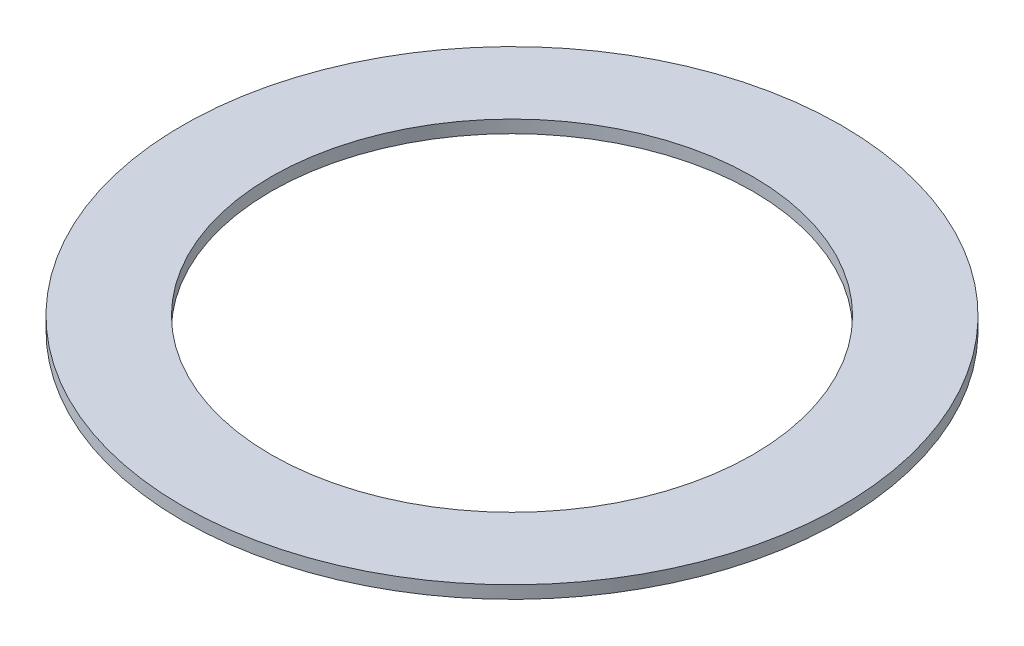
ISO-10303-21;
HEADER;
FILE_DESCRIPTION(('STEP AP214'),'2;1');
FILE_NAME('part.step','',(''),(''),'','','');
FILE_SCHEMA(('AUTOMOTIVE_DESIGN { 1 0 10303 214 1 1 1 1 }'));
ENDSEC;
DATA;
#1=APPLICATION_CONTEXT('core data for automotive mechanical design processes');
#2=APPLICATION_PROTOCOL_DEFINITION('international standard','automotive_design',2000,#1);
#3=PRODUCT_CONTEXT('',#1,'mechanical');
#4=PRODUCT('Part','Part','',(#3));
#5=PRODUCT_RELATED_PRODUCT_CATEGORY('part','',(#4));
#6=PRODUCT_DEFINITION_FORMATION('','',#4);
#7=PRODUCT_DEFINITION_CONTEXT('part definition',#1,'design');
#8=PRODUCT_DEFINITION('design','',#6,#7);
#9=PRODUCT_DEFINITION_SHAPE('','',#8);
#10=(LENGTH_UNIT() NAMED_UNIT(*) SI_UNIT(.MILLI.,.METRE.));
#11=(NAMED_UNIT(*) PLANE_ANGLE_UNIT() SI_UNIT($,.RADIAN.));
#12=(NAMED_UNIT(*) SI_UNIT($,.STERADIAN.) SOLID_ANGLE_UNIT());
#13=UNCERTAINTY_MEASURE_WITH_UNIT(LENGTH_MEASURE(1.E-05),#10,'distance_accuracy_value','');
#14=(GEOMETRIC_REPRESENTATION_CONTEXT(3) GLOBAL_UNCERTAINTY_ASSIGNED_CONTEXT((#13)) GLOBAL_UNIT_ASSIGNED_CONTEXT((#10,
#11,#12)) REPRESENTATION_CONTEXT('',''));
#15=CARTESIAN_POINT('',(0.,0.,0.));
#16=DIRECTION('',(0.,0.,1.));
#17=DIRECTION('',(1.,0.,0.));
#18=AXIS2_PLACEMENT_3D('',#15,#16,#17);
#19=CARTESIAN_POINT('',(0.,0.5,0.));
#20=DIRECTION('',(0.,1.,0.));
#21=DIRECTION('',(0.,0.,1.));
#22=AXIS2_PLACEMENT_3D('',#19,#20,#21);
#23=PLANE('',#22);
#24=CARTESIAN_POINT('',(0.,0.5,0.));
#25=DIRECTION('',(0.,1.,0.));
#26=DIRECTION('',(0.,0.,1.));
#27=AXIS2_PLACEMENT_3D('',#24,#25,#26);
#28=CIRCLE('',#27,13.);
#29=CARTESIAN_POINT('',(0.,0.5,13.));
#30=VERTEX_POINT('',#29);
#31=EDGE_CURVE('E10',#30,#30,#28,.T.);
#32=ORIENTED_EDGE('',*,*,#31,.T.);
#33=EDGE_LOOP('',(#32));
#34=FACE_BOUND('',#33,.T.);
#35=CARTESIAN_POINT('',(0.,0.5,0.));
#36=DIRECTION('',(0.,1.,0.));
#37=DIRECTION('',(0.,0.,1.));
#38=AXIS2_PLACEMENT_3D('',#35,#36,#37);
#39=CIRCLE('',#38,9.5);
#40=CARTESIAN_POINT('',(0.,0.5,9.5));
#41=VERTEX_POINT('',#40);
#42=EDGE_CURVE('E46',#41,#41,#39,.T.);
#43=ORIENTED_EDGE('',*,*,#42,.F.);
#44=EDGE_LOOP('',(#43));
#45=FACE_BOUND('',#44,.T.);
#46=ADVANCED_FACE('F35',(#34,#45),#23,.T.);
#47=CARTESIAN_POINT('',(0.,0.,0.));
#48=DIRECTION('',(0.,1.,0.));
#49=DIRECTION('',(0.,0.,1.));
#50=AXIS2_PLACEMENT_3D('',#47,#48,#49);
#51=PLANE('',#50);
#52=CARTESIAN_POINT('',(0.,0.,0.));
#53=DIRECTION('',(0.,1.,0.));
#54=DIRECTION('',(0.,0.,1.));
#55=AXIS2_PLACEMENT_3D('',#52,#53,#54);
#56=CIRCLE('',#55,13.);
#57=CARTESIAN_POINT('',(0.,0.,13.));
#58=VERTEX_POINT('',#57);
#59=EDGE_CURVE('E39',#58,#58,#56,.T.);
#60=ORIENTED_EDGE('',*,*,#59,.F.);
#61=EDGE_LOOP('',(#60));
#62=FACE_BOUND('',#61,.T.);
#63=CARTESIAN_POINT('',(0.,0.,0.));
#64=DIRECTION('',(0.,1.,0.));
#65=DIRECTION('',(0.,0.,1.));
#66=AXIS2_PLACEMENT_3D('',#63,#64,#65);
#67=CIRCLE('',#66,9.5);
#68=CARTESIAN_POINT('',(0.,0.,9.5));
#69=VERTEX_POINT('',#68);
#70=EDGE_CURVE('E48',#69,#69,#67,.T.);
#71=ORIENTED_EDGE('',*,*,#70,.T.);
#72=EDGE_LOOP('',(#71));
#73=FACE_BOUND('',#72,.T.);
#74=ADVANCED_FACE('F58',(#62,#73),#51,.F.);
#75=CARTESIAN_POINT('',(0.,0.5,0.));
#76=DIRECTION('',(0.,-1.,0.));
#77=DIRECTION('',(0.,0.,-1.));
#78=AXIS2_PLACEMENT_3D('',#75,#76,#77);
#79=CYLINDRICAL_SURFACE('',#78,13.);
#80=ORIENTED_EDGE('',*,*,#31,.F.);
#81=EDGE_LOOP('',(#80));
#82=FACE_BOUND('',#81,.T.);
#83=ORIENTED_EDGE('',*,*,#59,.T.);
#84=EDGE_LOOP('',(#83));
#85=FACE_BOUND('',#84,.T.);
#86=ADVANCED_FACE('F37',(#82,#85),#79,.T.);
#87=CARTESIAN_POINT('',(0.,0.5,0.));
#88=DIRECTION('',(0.,-1.,0.));
#89=DIRECTION('',(0.,0.,-1.));
#90=AXIS2_PLACEMENT_3D('',#87,#88,#89);
#91=CYLINDRICAL_SURFACE('',#90,9.5);
#92=ORIENTED_EDGE('',*,*,#42,.T.);
#93=EDGE_LOOP('',(#92));
#94=FACE_BOUND('',#93,.T.);
#95=ORIENTED_EDGE('',*,*,#70,.F.);
#96=EDGE_LOOP('',(#95));
#97=FACE_BOUND('',#96,.T.);
#98=ADVANCED_FACE('F54',(#94,#97),#91,.F.);
#99=CLOSED_SHELL('',(#46,#74,#86,#98));
#100=MANIFOLD_SOLID_BREP('B2',#99);
#101=ADVANCED_BREP_SHAPE_REPRESENTATION('',(#18,#100),#14);
#102=SHAPE_DEFINITION_REPRESENTATION(#9,#101);
ENDSEC;
END-ISO-10303-21;
